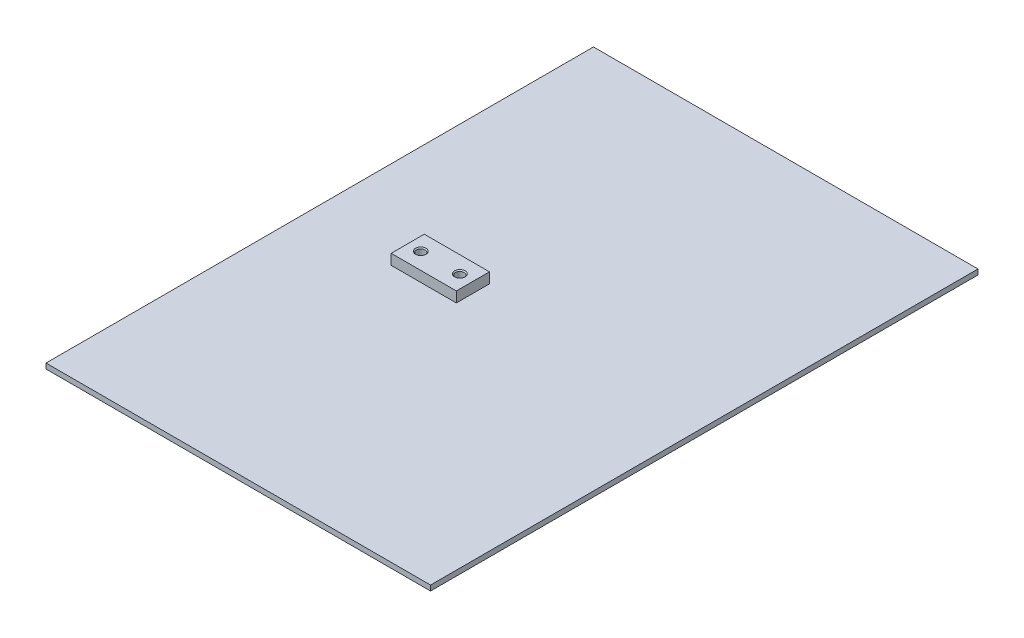
ISO-10303-21;
HEADER;
FILE_DESCRIPTION(('STEP AP214'),'2;1');
FILE_NAME('part.step','',(''),(''),'','','');
FILE_SCHEMA(('AUTOMOTIVE_DESIGN { 1 0 10303 214 1 1 1 1 }'));
ENDSEC;
DATA;
#1=APPLICATION_CONTEXT('core data for automotive mechanical design processes');
#2=APPLICATION_PROTOCOL_DEFINITION('international standard','automotive_design',2000,#1);
#3=PRODUCT_CONTEXT('',#1,'mechanical');
#4=PRODUCT('Part','Part','',(#3));
#5=PRODUCT_RELATED_PRODUCT_CATEGORY('part','',(#4));
#6=PRODUCT_DEFINITION_FORMATION('','',#4);
#7=PRODUCT_DEFINITION_CONTEXT('part definition',#1,'design');
#8=PRODUCT_DEFINITION('design','',#6,#7);
#9=PRODUCT_DEFINITION_SHAPE('','',#8);
#10=(LENGTH_UNIT() NAMED_UNIT(*) SI_UNIT(.MILLI.,.METRE.));
#11=(NAMED_UNIT(*) PLANE_ANGLE_UNIT() SI_UNIT($,.RADIAN.));
#12=(NAMED_UNIT(*) SI_UNIT($,.STERADIAN.) SOLID_ANGLE_UNIT());
#13=UNCERTAINTY_MEASURE_WITH_UNIT(LENGTH_MEASURE(1.E-05),#10,'distance_accuracy_value','');
#14=(GEOMETRIC_REPRESENTATION_CONTEXT(3) GLOBAL_UNCERTAINTY_ASSIGNED_CONTEXT((#13)) GLOBAL_UNIT_ASSIGNED_CONTEXT((#10,
#11,#12)) REPRESENTATION_CONTEXT('',''));
#15=CARTESIAN_POINT('',(0.,0.,0.));
#16=DIRECTION('',(0.,0.,1.));
#17=DIRECTION('',(1.,0.,0.));
#18=AXIS2_PLACEMENT_3D('',#15,#16,#17);
#19=CARTESIAN_POINT('',(0.,2.,0.));
#20=DIRECTION('',(0.,-1.,0.));
#21=DIRECTION('',(0.,0.,-1.));
#22=AXIS2_PLACEMENT_3D('',#19,#20,#21);
#23=PLANE('',#22);
#24=DIRECTION('',(0.,0.,-1.));
#25=VECTOR('',#24,1.);
#26=CARTESIAN_POINT('',(73.75,2.,105.));
#27=LINE('',#26,#25);
#28=CARTESIAN_POINT('',(73.75,2.,105.));
#29=VERTEX_POINT('',#28);
#30=CARTESIAN_POINT('',(73.75,2.,-105.));
#31=VERTEX_POINT('',#30);
#32=EDGE_CURVE('E167',#29,#31,#27,.T.);
#33=ORIENTED_EDGE('',*,*,#32,.T.);
#34=DIRECTION('',(-1.,0.,0.));
#35=VECTOR('',#34,1.);
#36=CARTESIAN_POINT('',(-73.75,2.,-105.));
#37=LINE('',#36,#35);
#38=CARTESIAN_POINT('',(-73.75,2.,-105.));
#39=VERTEX_POINT('',#38);
#40=EDGE_CURVE('E106',#31,#39,#37,.T.);
#41=ORIENTED_EDGE('',*,*,#40,.T.);
#42=DIRECTION('',(0.,0.,1.));
#43=VECTOR('',#42,1.);
#44=CARTESIAN_POINT('',(-73.75,2.,105.));
#45=LINE('',#44,#43);
#46=CARTESIAN_POINT('',(-73.75,2.,105.));
#47=VERTEX_POINT('',#46);
#48=EDGE_CURVE('E172',#39,#47,#45,.T.);
#49=ORIENTED_EDGE('',*,*,#48,.T.);
#50=DIRECTION('',(1.,0.,0.));
#51=VECTOR('',#50,1.);
#52=CARTESIAN_POINT('',(-73.75,2.,105.));
#53=LINE('',#52,#51);
#54=EDGE_CURVE('E78',#47,#29,#53,.T.);
#55=ORIENTED_EDGE('',*,*,#54,.T.);
#56=EDGE_LOOP('',(#33,#41,#49,#55));
#57=FACE_BOUND('',#56,.T.);
#58=DIRECTION('',(0.,0.,-1.));
#59=VECTOR('',#58,1.);
#60=CARTESIAN_POINT('',(-15.,2.,6.35));
#61=LINE('',#60,#59);
#62=CARTESIAN_POINT('',(-15.,2.,6.35));
#63=VERTEX_POINT('',#62);
#64=CARTESIAN_POINT('',(-15.,2.,-6.35));
#65=VERTEX_POINT('',#64);
#66=EDGE_CURVE('E153',#63,#65,#61,.T.);
#67=ORIENTED_EDGE('',*,*,#66,.F.);
#68=DIRECTION('',(-1.,0.,0.));
#69=VECTOR('',#68,1.);
#70=CARTESIAN_POINT('',(-15.,2.,6.35));
#71=LINE('',#70,#69);
#72=CARTESIAN_POINT('',(-40.,2.,6.35));
#73=VERTEX_POINT('',#72);
#74=EDGE_CURVE('E149',#63,#73,#71,.T.);
#75=ORIENTED_EDGE('',*,*,#74,.T.);
#76=DIRECTION('',(0.,0.,-1.));
#77=VECTOR('',#76,1.);
#78=CARTESIAN_POINT('',(-40.,2.,6.35));
#79=LINE('',#78,#77);
#80=CARTESIAN_POINT('',(-40.,2.,-6.35));
#81=VERTEX_POINT('',#80);
#82=EDGE_CURVE('E69',#73,#81,#79,.T.);
#83=ORIENTED_EDGE('',*,*,#82,.T.);
#84=DIRECTION('',(-1.,0.,0.));
#85=VECTOR('',#84,1.);
#86=CARTESIAN_POINT('',(-15.,2.,-6.35));
#87=LINE('',#86,#85);
#88=EDGE_CURVE('E287',#65,#81,#87,.T.);
#89=ORIENTED_EDGE('',*,*,#88,.F.);
#90=EDGE_LOOP('',(#67,#75,#83,#89));
#91=FACE_BOUND('',#90,.T.);
#92=ADVANCED_FACE('F53',(#57,#91),#23,.F.);
#93=CARTESIAN_POINT('',(73.75,2.,105.));
#94=DIRECTION('',(-1.,0.,0.));
#95=DIRECTION('',(0.,0.,1.));
#96=AXIS2_PLACEMENT_3D('',#93,#94,#95);
#97=PLANE('',#96);
#98=DIRECTION('',(0.,0.,-1.));
#99=VECTOR('',#98,1.);
#100=CARTESIAN_POINT('',(73.75,0.,105.));
#101=LINE('',#100,#99);
#102=CARTESIAN_POINT('',(73.75,0.,105.));
#103=VERTEX_POINT('',#102);
#104=CARTESIAN_POINT('',(73.75,0.,-105.));
#105=VERTEX_POINT('',#104);
#106=EDGE_CURVE('E156',#103,#105,#101,.T.);
#107=ORIENTED_EDGE('',*,*,#106,.T.);
#108=DIRECTION('',(0.,-1.,0.));
#109=VECTOR('',#108,1.);
#110=CARTESIAN_POINT('',(73.75,2.,-105.));
#111=LINE('',#110,#109);
#112=EDGE_CURVE('E11',#31,#105,#111,.T.);
#113=ORIENTED_EDGE('',*,*,#112,.F.);
#114=ORIENTED_EDGE('',*,*,#32,.F.);
#115=DIRECTION('',(0.,-1.,0.));
#116=VECTOR('',#115,1.);
#117=CARTESIAN_POINT('',(73.75,2.,105.));
#118=LINE('',#117,#116);
#119=EDGE_CURVE('E176',#29,#103,#118,.T.);
#120=ORIENTED_EDGE('',*,*,#119,.T.);
#121=EDGE_LOOP('',(#107,#113,#114,#120));
#122=FACE_BOUND('',#121,.T.);
#123=ADVANCED_FACE('F55',(#122),#97,.F.);
#124=CARTESIAN_POINT('',(-73.75,2.,-105.));
#125=DIRECTION('',(0.,0.,1.));
#126=DIRECTION('',(1.,0.,0.));
#127=AXIS2_PLACEMENT_3D('',#124,#125,#126);
#128=PLANE('',#127);
#129=DIRECTION('',(-1.,0.,0.));
#130=VECTOR('',#129,1.);
#131=CARTESIAN_POINT('',(-73.75,0.,-105.));
#132=LINE('',#131,#130);
#133=CARTESIAN_POINT('',(-73.75,0.,-105.));
#134=VERTEX_POINT('',#133);
#135=EDGE_CURVE('E161',#105,#134,#132,.T.);
#136=ORIENTED_EDGE('',*,*,#135,.T.);
#137=DIRECTION('',(0.,-1.,0.));
#138=VECTOR('',#137,1.);
#139=CARTESIAN_POINT('',(-73.75,2.,-105.));
#140=LINE('',#139,#138);
#141=EDGE_CURVE('E62',#39,#134,#140,.T.);
#142=ORIENTED_EDGE('',*,*,#141,.F.);
#143=ORIENTED_EDGE('',*,*,#40,.F.);
#144=ORIENTED_EDGE('',*,*,#112,.T.);
#145=EDGE_LOOP('',(#136,#142,#143,#144));
#146=FACE_BOUND('',#145,.T.);
#147=ADVANCED_FACE('F212',(#146),#128,.F.);
#148=CARTESIAN_POINT('',(-73.75,2.,105.));
#149=DIRECTION('',(1.,0.,0.));
#150=DIRECTION('',(0.,0.,-1.));
#151=AXIS2_PLACEMENT_3D('',#148,#149,#150);
#152=PLANE('',#151);
#153=DIRECTION('',(0.,0.,1.));
#154=VECTOR('',#153,1.);
#155=CARTESIAN_POINT('',(-73.75,0.,105.));
#156=LINE('',#155,#154);
#157=CARTESIAN_POINT('',(-73.75,0.,105.));
#158=VERTEX_POINT('',#157);
#159=EDGE_CURVE('E180',#134,#158,#156,.T.);
#160=ORIENTED_EDGE('',*,*,#159,.T.);
#161=DIRECTION('',(0.,-1.,0.));
#162=VECTOR('',#161,1.);
#163=CARTESIAN_POINT('',(-73.75,2.,105.));
#164=LINE('',#163,#162);
#165=EDGE_CURVE('E187',#47,#158,#164,.T.);
#166=ORIENTED_EDGE('',*,*,#165,.F.);
#167=ORIENTED_EDGE('',*,*,#48,.F.);
#168=ORIENTED_EDGE('',*,*,#141,.T.);
#169=EDGE_LOOP('',(#160,#166,#167,#168));
#170=FACE_BOUND('',#169,.T.);
#171=ADVANCED_FACE('F194',(#170),#152,.F.);
#172=CARTESIAN_POINT('',(-73.75,2.,105.));
#173=DIRECTION('',(0.,0.,-1.));
#174=DIRECTION('',(-1.,0.,0.));
#175=AXIS2_PLACEMENT_3D('',#172,#173,#174);
#176=PLANE('',#175);
#177=DIRECTION('',(1.,0.,0.));
#178=VECTOR('',#177,1.);
#179=CARTESIAN_POINT('',(-73.75,0.,105.));
#180=LINE('',#179,#178);
#181=EDGE_CURVE('E99',#158,#103,#180,.T.);
#182=ORIENTED_EDGE('',*,*,#181,.T.);
#183=ORIENTED_EDGE('',*,*,#119,.F.);
#184=ORIENTED_EDGE('',*,*,#54,.F.);
#185=ORIENTED_EDGE('',*,*,#165,.T.);
#186=EDGE_LOOP('',(#182,#183,#184,#185));
#187=FACE_BOUND('',#186,.T.);
#188=ADVANCED_FACE('F202',(#187),#176,.F.);
#189=CARTESIAN_POINT('',(0.,0.,0.));
#190=DIRECTION('',(0.,-1.,0.));
#191=DIRECTION('',(0.,0.,-1.));
#192=AXIS2_PLACEMENT_3D('',#189,#190,#191);
#193=PLANE('',#192);
#194=CARTESIAN_POINT('',(-20.,0.,0.));
#195=DIRECTION('',(0.,1.,0.));
#196=DIRECTION('',(0.,0.,1.));
#197=AXIS2_PLACEMENT_3D('',#194,#195,#196);
#198=CIRCLE('',#197,1.65);
#199=CARTESIAN_POINT('',(-20.,0.,1.65));
#200=VERTEX_POINT('',#199);
#201=EDGE_CURVE('E262',#200,#200,#198,.T.);
#202=ORIENTED_EDGE('',*,*,#201,.T.);
#203=EDGE_LOOP('',(#202));
#204=FACE_BOUND('',#203,.T.);
#205=CARTESIAN_POINT('',(-35.,0.,0.));
#206=DIRECTION('',(0.,1.,0.));
#207=DIRECTION('',(0.,0.,1.));
#208=AXIS2_PLACEMENT_3D('',#205,#206,#207);
#209=CIRCLE('',#208,1.65);
#210=CARTESIAN_POINT('',(-35.,0.,1.65));
#211=VERTEX_POINT('',#210);
#212=EDGE_CURVE('E276',#211,#211,#209,.T.);
#213=ORIENTED_EDGE('',*,*,#212,.T.);
#214=EDGE_LOOP('',(#213));
#215=FACE_BOUND('',#214,.T.);
#216=ORIENTED_EDGE('',*,*,#106,.F.);
#217=ORIENTED_EDGE('',*,*,#181,.F.);
#218=ORIENTED_EDGE('',*,*,#159,.F.);
#219=ORIENTED_EDGE('',*,*,#135,.F.);
#220=EDGE_LOOP('',(#216,#217,#218,#219));
#221=FACE_BOUND('',#220,.T.);
#222=ADVANCED_FACE('F198',(#204,#215,#221),#193,.T.);
#223=CARTESIAN_POINT('',(-15.,6.,6.35));
#224=DIRECTION('',(-1.,0.,0.));
#225=DIRECTION('',(0.,0.,1.));
#226=AXIS2_PLACEMENT_3D('',#223,#224,#225);
#227=PLANE('',#226);
#228=ORIENTED_EDGE('',*,*,#66,.T.);
#229=DIRECTION('',(0.,-1.,0.));
#230=VECTOR('',#229,1.);
#231=CARTESIAN_POINT('',(-15.,6.,-6.35));
#232=LINE('',#231,#230);
#233=CARTESIAN_POINT('',(-15.,6.,-6.35));
#234=VERTEX_POINT('',#233);
#235=EDGE_CURVE('E132',#234,#65,#232,.T.);
#236=ORIENTED_EDGE('',*,*,#235,.F.);
#237=DIRECTION('',(0.,0.,-1.));
#238=VECTOR('',#237,1.);
#239=CARTESIAN_POINT('',(-15.,6.,6.35));
#240=LINE('',#239,#238);
#241=CARTESIAN_POINT('',(-15.,6.,6.35));
#242=VERTEX_POINT('',#241);
#243=EDGE_CURVE('E140',#242,#234,#240,.T.);
#244=ORIENTED_EDGE('',*,*,#243,.F.);
#245=DIRECTION('',(0.,-1.,0.));
#246=VECTOR('',#245,1.);
#247=CARTESIAN_POINT('',(-15.,6.,6.35));
#248=LINE('',#247,#246);
#249=EDGE_CURVE('E284',#242,#63,#248,.T.);
#250=ORIENTED_EDGE('',*,*,#249,.T.);
#251=EDGE_LOOP('',(#228,#236,#244,#250));
#252=FACE_BOUND('',#251,.T.);
#253=ADVANCED_FACE('F151',(#252),#227,.F.);
#254=CARTESIAN_POINT('',(-15.,6.,-6.35));
#255=DIRECTION('',(0.,0.,1.));
#256=DIRECTION('',(1.,0.,0.));
#257=AXIS2_PLACEMENT_3D('',#254,#255,#256);
#258=PLANE('',#257);
#259=ORIENTED_EDGE('',*,*,#88,.T.);
#260=DIRECTION('',(0.,-1.,0.));
#261=VECTOR('',#260,1.);
#262=CARTESIAN_POINT('',(-40.,6.,-6.35));
#263=LINE('',#262,#261);
#264=CARTESIAN_POINT('',(-40.,6.,-6.35));
#265=VERTEX_POINT('',#264);
#266=EDGE_CURVE('E134',#265,#81,#263,.T.);
#267=ORIENTED_EDGE('',*,*,#266,.F.);
#268=DIRECTION('',(-1.,0.,0.));
#269=VECTOR('',#268,1.);
#270=CARTESIAN_POINT('',(-15.,6.,-6.35));
#271=LINE('',#270,#269);
#272=EDGE_CURVE('E127',#234,#265,#271,.T.);
#273=ORIENTED_EDGE('',*,*,#272,.F.);
#274=ORIENTED_EDGE('',*,*,#235,.T.);
#275=EDGE_LOOP('',(#259,#267,#273,#274));
#276=FACE_BOUND('',#275,.T.);
#277=ADVANCED_FACE('F130',(#276),#258,.F.);
#278=CARTESIAN_POINT('',(-40.,6.,6.35));
#279=DIRECTION('',(-1.,0.,0.));
#280=DIRECTION('',(0.,0.,1.));
#281=AXIS2_PLACEMENT_3D('',#278,#279,#280);
#282=PLANE('',#281);
#283=ORIENTED_EDGE('',*,*,#82,.F.);
#284=DIRECTION('',(0.,-1.,0.));
#285=VECTOR('',#284,1.);
#286=CARTESIAN_POINT('',(-40.,6.,6.35));
#287=LINE('',#286,#285);
#288=CARTESIAN_POINT('',(-40.,6.,6.35));
#289=VERTEX_POINT('',#288);
#290=EDGE_CURVE('E163',#289,#73,#287,.T.);
#291=ORIENTED_EDGE('',*,*,#290,.F.);
#292=DIRECTION('',(0.,0.,-1.));
#293=VECTOR('',#292,1.);
#294=CARTESIAN_POINT('',(-40.,6.,6.35));
#295=LINE('',#294,#293);
#296=EDGE_CURVE('E139',#289,#265,#295,.T.);
#297=ORIENTED_EDGE('',*,*,#296,.T.);
#298=ORIENTED_EDGE('',*,*,#266,.T.);
#299=EDGE_LOOP('',(#283,#291,#297,#298));
#300=FACE_BOUND('',#299,.T.);
#301=ADVANCED_FACE('F224',(#300),#282,.T.);
#302=CARTESIAN_POINT('',(-15.,6.,6.35));
#303=DIRECTION('',(0.,0.,1.));
#304=DIRECTION('',(1.,0.,0.));
#305=AXIS2_PLACEMENT_3D('',#302,#303,#304);
#306=PLANE('',#305);
#307=ORIENTED_EDGE('',*,*,#74,.F.);
#308=ORIENTED_EDGE('',*,*,#249,.F.);
#309=DIRECTION('',(-1.,0.,0.));
#310=VECTOR('',#309,1.);
#311=CARTESIAN_POINT('',(-15.,6.,6.35));
#312=LINE('',#311,#310);
#313=EDGE_CURVE('E146',#242,#289,#312,.T.);
#314=ORIENTED_EDGE('',*,*,#313,.T.);
#315=ORIENTED_EDGE('',*,*,#290,.T.);
#316=EDGE_LOOP('',(#307,#308,#314,#315));
#317=FACE_BOUND('',#316,.T.);
#318=ADVANCED_FACE('F227',(#317),#306,.T.);
#319=CARTESIAN_POINT('',(0.,6.,0.));
#320=DIRECTION('',(0.,1.,0.));
#321=DIRECTION('',(0.,0.,1.));
#322=AXIS2_PLACEMENT_3D('',#319,#320,#321);
#323=PLANE('',#322);
#324=CARTESIAN_POINT('',(-20.,6.,0.));
#325=DIRECTION('',(0.,1.,0.));
#326=DIRECTION('',(0.,0.,1.));
#327=AXIS2_PLACEMENT_3D('',#324,#325,#326);
#328=CIRCLE('',#327,2.025);
#329=CARTESIAN_POINT('',(-20.,6.,2.025));
#330=VERTEX_POINT('',#329);
#331=EDGE_CURVE('E258',#330,#330,#328,.T.);
#332=ORIENTED_EDGE('',*,*,#331,.F.);
#333=EDGE_LOOP('',(#332));
#334=FACE_BOUND('',#333,.T.);
#335=CARTESIAN_POINT('',(-35.,6.,0.));
#336=DIRECTION('',(0.,1.,0.));
#337=DIRECTION('',(0.,0.,1.));
#338=AXIS2_PLACEMENT_3D('',#335,#336,#337);
#339=CIRCLE('',#338,2.025);
#340=CARTESIAN_POINT('',(-35.,6.,2.025));
#341=VERTEX_POINT('',#340);
#342=EDGE_CURVE('E268',#341,#341,#339,.T.);
#343=ORIENTED_EDGE('',*,*,#342,.F.);
#344=EDGE_LOOP('',(#343));
#345=FACE_BOUND('',#344,.T.);
#346=ORIENTED_EDGE('',*,*,#243,.T.);
#347=ORIENTED_EDGE('',*,*,#272,.T.);
#348=ORIENTED_EDGE('',*,*,#296,.F.);
#349=ORIENTED_EDGE('',*,*,#313,.F.);
#350=EDGE_LOOP('',(#346,#347,#348,#349));
#351=FACE_BOUND('',#350,.T.);
#352=ADVANCED_FACE('F144',(#334,#345,#351),#323,.T.);
#353=CARTESIAN_POINT('',(-35.,6.,0.));
#354=DIRECTION('',(0.,1.,0.));
#355=DIRECTION('',(0.,0.,1.));
#356=AXIS2_PLACEMENT_3D('',#353,#354,#355);
#357=CYLINDRICAL_SURFACE('',#356,1.65);
#358=ORIENTED_EDGE('',*,*,#212,.F.);
#359=EDGE_LOOP('',(#358));
#360=FACE_BOUND('',#359,.T.);
#361=CARTESIAN_POINT('',(-35.,5.625,0.));
#362=DIRECTION('',(0.,1.,0.));
#363=DIRECTION('',(0.,0.,1.));
#364=AXIS2_PLACEMENT_3D('',#361,#362,#363);
#365=CIRCLE('',#364,1.65);
#366=CARTESIAN_POINT('',(-35.,5.625,1.65));
#367=VERTEX_POINT('',#366);
#368=EDGE_CURVE('E272',#367,#367,#365,.T.);
#369=ORIENTED_EDGE('',*,*,#368,.T.);
#370=EDGE_LOOP('',(#369));
#371=FACE_BOUND('',#370,.T.);
#372=ADVANCED_FACE('F233',(#360,#371),#357,.F.);
#373=CARTESIAN_POINT('',(-35.,6.,0.));
#374=DIRECTION('',(0.,1.,0.));
#375=DIRECTION('',(0.,0.,1.));
#376=AXIS2_PLACEMENT_3D('',#373,#374,#375);
#377=CONICAL_SURFACE('',#376,2.025,0.785398163397447);
#378=ORIENTED_EDGE('',*,*,#368,.F.);
#379=EDGE_LOOP('',(#378));
#380=FACE_BOUND('',#379,.T.);
#381=ORIENTED_EDGE('',*,*,#342,.T.);
#382=EDGE_LOOP('',(#381));
#383=FACE_BOUND('',#382,.T.);
#384=ADVANCED_FACE('F237',(#380,#383),#377,.F.);
#385=CARTESIAN_POINT('',(-20.,6.,0.));
#386=DIRECTION('',(0.,1.,0.));
#387=DIRECTION('',(0.,0.,1.));
#388=AXIS2_PLACEMENT_3D('',#385,#386,#387);
#389=CYLINDRICAL_SURFACE('',#388,1.65);
#390=ORIENTED_EDGE('',*,*,#201,.F.);
#391=EDGE_LOOP('',(#390));
#392=FACE_BOUND('',#391,.T.);
#393=CARTESIAN_POINT('',(-20.,5.625,0.));
#394=DIRECTION('',(0.,1.,0.));
#395=DIRECTION('',(0.,0.,1.));
#396=AXIS2_PLACEMENT_3D('',#393,#394,#395);
#397=CIRCLE('',#396,1.65);
#398=CARTESIAN_POINT('',(-20.,5.625,1.65));
#399=VERTEX_POINT('',#398);
#400=EDGE_CURVE('E255',#399,#399,#397,.T.);
#401=ORIENTED_EDGE('',*,*,#400,.T.);
#402=EDGE_LOOP('',(#401));
#403=FACE_BOUND('',#402,.T.);
#404=ADVANCED_FACE('F241',(#392,#403),#389,.F.);
#405=CARTESIAN_POINT('',(-20.,6.,0.));
#406=DIRECTION('',(0.,1.,0.));
#407=DIRECTION('',(0.,0.,1.));
#408=AXIS2_PLACEMENT_3D('',#405,#406,#407);
#409=CONICAL_SURFACE('',#408,2.025,0.785398163397447);
#410=ORIENTED_EDGE('',*,*,#400,.F.);
#411=EDGE_LOOP('',(#410));
#412=FACE_BOUND('',#411,.T.);
#413=ORIENTED_EDGE('',*,*,#331,.T.);
#414=EDGE_LOOP('',(#413));
#415=FACE_BOUND('',#414,.T.);
#416=ADVANCED_FACE('F245',(#412,#415),#409,.F.);
#417=CLOSED_SHELL('',(#92,#123,#147,#171,#188,#222,#253,#277,#301,#318,#352,#372,#384,#404,#416));
#418=MANIFOLD_SOLID_BREP('B2',#417);
#419=ADVANCED_BREP_SHAPE_REPRESENTATION('',(#18,#418),#14);
#420=SHAPE_DEFINITION_REPRESENTATION(#9,#419);
ENDSEC;
END-ISO-10303-21;
